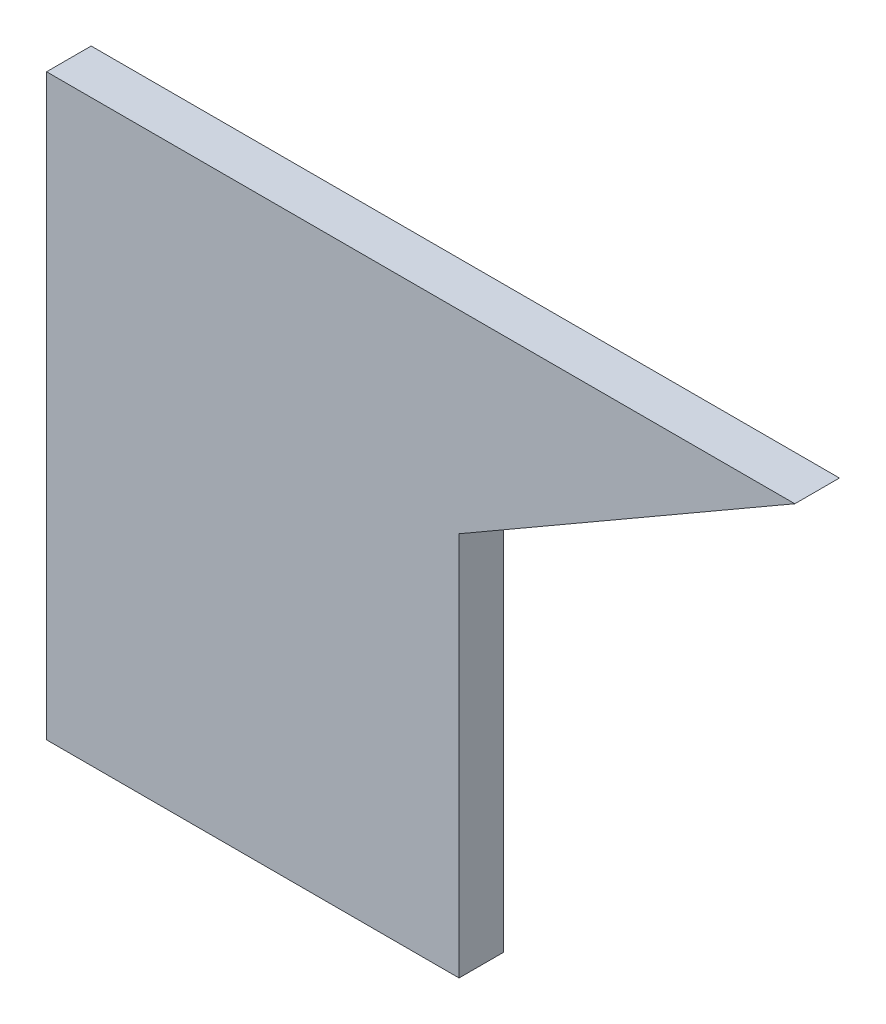
ISO-10303-21;
HEADER;
FILE_DESCRIPTION(('STEP AP214'),'2;1');
FILE_NAME('part.step','',(''),(''),'','','');
FILE_SCHEMA(('AUTOMOTIVE_DESIGN { 1 0 10303 214 1 1 1 1 }'));
ENDSEC;
DATA;
#1=APPLICATION_CONTEXT('core data for automotive mechanical design processes');
#2=APPLICATION_PROTOCOL_DEFINITION('international standard','automotive_design',2000,#1);
#3=PRODUCT_CONTEXT('',#1,'mechanical');
#4=PRODUCT('Part','Part','',(#3));
#5=PRODUCT_RELATED_PRODUCT_CATEGORY('part','',(#4));
#6=PRODUCT_DEFINITION_FORMATION('','',#4);
#7=PRODUCT_DEFINITION_CONTEXT('part definition',#1,'design');
#8=PRODUCT_DEFINITION('design','',#6,#7);
#9=PRODUCT_DEFINITION_SHAPE('','',#8);
#10=(LENGTH_UNIT() NAMED_UNIT(*) SI_UNIT(.MILLI.,.METRE.));
#11=(NAMED_UNIT(*) PLANE_ANGLE_UNIT() SI_UNIT($,.RADIAN.));
#12=(NAMED_UNIT(*) SI_UNIT($,.STERADIAN.) SOLID_ANGLE_UNIT());
#13=UNCERTAINTY_MEASURE_WITH_UNIT(LENGTH_MEASURE(1.E-05),#10,'distance_accuracy_value','');
#14=(GEOMETRIC_REPRESENTATION_CONTEXT(3) GLOBAL_UNCERTAINTY_ASSIGNED_CONTEXT((#13)) GLOBAL_UNIT_ASSIGNED_CONTEXT((#10,
#11,#12)) REPRESENTATION_CONTEXT('',''));
#15=CARTESIAN_POINT('',(0.,0.,0.));
#16=DIRECTION('',(0.,0.,1.));
#17=DIRECTION('',(1.,0.,0.));
#18=AXIS2_PLACEMENT_3D('',#15,#16,#17);
#19=CARTESIAN_POINT('',(-58.7375000000003,-82.3912500000004,6.35));
#20=DIRECTION('',(1.,0.,0.));
#21=DIRECTION('',(0.,0.,-1.));
#22=AXIS2_PLACEMENT_3D('',#19,#20,#21);
#23=PLANE('',#22);
#24=DIRECTION('',(0.,-1.,0.));
#25=VECTOR('',#24,1.);
#26=CARTESIAN_POINT('',(-58.7375000000003,-82.3912500000004,-6.35));
#27=LINE('',#26,#25);
#28=CARTESIAN_POINT('',(-58.7375000000003,82.3912499999996,-6.35));
#29=VERTEX_POINT('',#28);
#30=CARTESIAN_POINT('',(-58.7375000000003,-82.3912500000004,-6.35));
#31=VERTEX_POINT('',#30);
#32=EDGE_CURVE('E107',#29,#31,#27,.T.);
#33=ORIENTED_EDGE('',*,*,#32,.T.);
#34=DIRECTION('',(0.,0.,-1.));
#35=VECTOR('',#34,1.);
#36=CARTESIAN_POINT('',(-58.7375000000003,-82.3912500000004,6.35));
#37=LINE('',#36,#35);
#38=CARTESIAN_POINT('',(-58.7375000000003,-82.3912500000004,6.35));
#39=VERTEX_POINT('',#38);
#40=EDGE_CURVE('E11',#39,#31,#37,.T.);
#41=ORIENTED_EDGE('',*,*,#40,.F.);
#42=DIRECTION('',(0.,-1.,0.));
#43=VECTOR('',#42,1.);
#44=CARTESIAN_POINT('',(-58.7375000000003,-82.3912500000004,6.35));
#45=LINE('',#44,#43);
#46=CARTESIAN_POINT('',(-58.7375000000003,82.3912499999996,6.35));
#47=VERTEX_POINT('',#46);
#48=EDGE_CURVE('E115',#47,#39,#45,.T.);
#49=ORIENTED_EDGE('',*,*,#48,.F.);
#50=DIRECTION('',(0.,0.,-1.));
#51=VECTOR('',#50,1.);
#52=CARTESIAN_POINT('',(-58.7375000000003,82.3912499999996,6.35));
#53=LINE('',#52,#51);
#54=EDGE_CURVE('E103',#47,#29,#53,.T.);
#55=ORIENTED_EDGE('',*,*,#54,.T.);
#56=EDGE_LOOP('',(#33,#41,#49,#55));
#57=FACE_BOUND('',#56,.T.);
#58=ADVANCED_FACE('F33',(#57),#23,.F.);
#59=CARTESIAN_POINT('',(-58.7375000000003,-82.3912500000004,6.35));
#60=DIRECTION('',(0.,1.,0.));
#61=DIRECTION('',(-1.,0.,0.));
#62=AXIS2_PLACEMENT_3D('',#59,#60,#61);
#63=PLANE('',#62);
#64=DIRECTION('',(1.,0.,0.));
#65=VECTOR('',#64,1.);
#66=CARTESIAN_POINT('',(-58.7375000000003,-82.3912500000004,-6.35));
#67=LINE('',#66,#65);
#68=CARTESIAN_POINT('',(58.7374999999981,-82.3912499999991,-6.35));
#69=VERTEX_POINT('',#68);
#70=EDGE_CURVE('E110',#31,#69,#67,.T.);
#71=ORIENTED_EDGE('',*,*,#70,.T.);
#72=DIRECTION('',(0.,0.,-1.));
#73=VECTOR('',#72,1.);
#74=CARTESIAN_POINT('',(58.7374999999981,-82.3912499999991,6.35));
#75=LINE('',#74,#73);
#76=CARTESIAN_POINT('',(58.7374999999981,-82.3912499999991,6.35));
#77=VERTEX_POINT('',#76);
#78=EDGE_CURVE('E41',#77,#69,#75,.T.);
#79=ORIENTED_EDGE('',*,*,#78,.F.);
#80=DIRECTION('',(1.,0.,0.));
#81=VECTOR('',#80,1.);
#82=CARTESIAN_POINT('',(-58.7375000000003,-82.3912500000004,6.35));
#83=LINE('',#82,#81);
#84=EDGE_CURVE('E83',#39,#77,#83,.T.);
#85=ORIENTED_EDGE('',*,*,#84,.F.);
#86=ORIENTED_EDGE('',*,*,#40,.T.);
#87=EDGE_LOOP('',(#71,#79,#85,#86));
#88=FACE_BOUND('',#87,.T.);
#89=ADVANCED_FACE('F134',(#88),#63,.F.);
#90=CARTESIAN_POINT('',(58.7374999999981,-82.3912499999991,6.35));
#91=DIRECTION('',(-1.,0.,0.));
#92=DIRECTION('',(0.,-1.,0.));
#93=AXIS2_PLACEMENT_3D('',#90,#91,#92);
#94=PLANE('',#93);
#95=DIRECTION('',(0.,1.,0.));
#96=VECTOR('',#95,1.);
#97=CARTESIAN_POINT('',(58.7374999999981,-82.3912499999991,-6.35));
#98=LINE('',#97,#96);
#99=CARTESIAN_POINT('',(58.7375000000009,27.1775809065801,-6.35));
#100=VERTEX_POINT('',#99);
#101=EDGE_CURVE('E98',#69,#100,#98,.T.);
#102=ORIENTED_EDGE('',*,*,#101,.T.);
#103=DIRECTION('',(0.,0.,-1.));
#104=VECTOR('',#103,1.);
#105=CARTESIAN_POINT('',(58.7375000000009,27.1775809065801,6.35));
#106=LINE('',#105,#104);
#107=CARTESIAN_POINT('',(58.7375000000009,27.1775809065801,6.35));
#108=VERTEX_POINT('',#107);
#109=EDGE_CURVE('E95',#108,#100,#106,.T.);
#110=ORIENTED_EDGE('',*,*,#109,.F.);
#111=DIRECTION('',(0.,1.,0.));
#112=VECTOR('',#111,1.);
#113=CARTESIAN_POINT('',(58.7374999999981,-82.3912499999991,6.35));
#114=LINE('',#113,#112);
#115=EDGE_CURVE('E87',#77,#108,#114,.T.);
#116=ORIENTED_EDGE('',*,*,#115,.F.);
#117=ORIENTED_EDGE('',*,*,#78,.T.);
#118=EDGE_LOOP('',(#102,#110,#116,#117));
#119=FACE_BOUND('',#118,.T.);
#120=ADVANCED_FACE('F96',(#119),#94,.F.);
#121=CARTESIAN_POINT('',(58.7375000000009,27.1775809065801,6.35));
#122=DIRECTION('',(-0.500000000000001,0.866025403784438,0.));
#123=DIRECTION('',(-0.866025403784438,-0.500000000000001,0.));
#124=AXIS2_PLACEMENT_3D('',#121,#122,#123);
#125=PLANE('',#124);
#126=DIRECTION('',(0.866025403784438,0.500000000000001,0.));
#127=VECTOR('',#126,1.);
#128=CARTESIAN_POINT('',(58.7375000000009,27.1775809065801,-6.35));
#129=LINE('',#128,#127);
#130=CARTESIAN_POINT('',(154.370380142099,82.3912499999996,-6.35));
#131=VERTEX_POINT('',#130);
#132=EDGE_CURVE('E69',#100,#131,#129,.T.);
#133=ORIENTED_EDGE('',*,*,#132,.T.);
#134=DIRECTION('',(0.,0.,-1.));
#135=VECTOR('',#134,1.);
#136=CARTESIAN_POINT('',(154.370380142099,82.3912499999996,6.35));
#137=LINE('',#136,#135);
#138=CARTESIAN_POINT('',(154.370380142099,82.3912499999996,6.35));
#139=VERTEX_POINT('',#138);
#140=EDGE_CURVE('E99',#139,#131,#137,.T.);
#141=ORIENTED_EDGE('',*,*,#140,.F.);
#142=DIRECTION('',(0.866025403784438,0.500000000000001,0.));
#143=VECTOR('',#142,1.);
#144=CARTESIAN_POINT('',(58.7375000000009,27.1775809065801,6.35));
#145=LINE('',#144,#143);
#146=EDGE_CURVE('E91',#108,#139,#145,.T.);
#147=ORIENTED_EDGE('',*,*,#146,.F.);
#148=ORIENTED_EDGE('',*,*,#109,.T.);
#149=EDGE_LOOP('',(#133,#141,#147,#148));
#150=FACE_BOUND('',#149,.T.);
#151=ADVANCED_FACE('F101',(#150),#125,.F.);
#152=CARTESIAN_POINT('',(-58.7375000000003,82.3912499999996,6.35));
#153=DIRECTION('',(0.,-1.,0.));
#154=DIRECTION('',(1.,0.,0.));
#155=AXIS2_PLACEMENT_3D('',#152,#153,#154);
#156=PLANE('',#155);
#157=DIRECTION('',(-1.,0.,0.));
#158=VECTOR('',#157,1.);
#159=CARTESIAN_POINT('',(-58.7375000000003,82.3912499999996,-6.35));
#160=LINE('',#159,#158);
#161=EDGE_CURVE('E75',#131,#29,#160,.T.);
#162=ORIENTED_EDGE('',*,*,#161,.T.);
#163=ORIENTED_EDGE('',*,*,#54,.F.);
#164=DIRECTION('',(-1.,0.,0.));
#165=VECTOR('',#164,1.);
#166=CARTESIAN_POINT('',(-58.7375000000003,82.3912499999996,6.35));
#167=LINE('',#166,#165);
#168=EDGE_CURVE('E49',#139,#47,#167,.T.);
#169=ORIENTED_EDGE('',*,*,#168,.F.);
#170=ORIENTED_EDGE('',*,*,#140,.T.);
#171=EDGE_LOOP('',(#162,#163,#169,#170));
#172=FACE_BOUND('',#171,.T.);
#173=ADVANCED_FACE('F123',(#172),#156,.F.);
#174=CARTESIAN_POINT('',(0.,0.,6.35));
#175=DIRECTION('',(0.,0.,-1.));
#176=DIRECTION('',(-1.,0.,0.));
#177=AXIS2_PLACEMENT_3D('',#174,#175,#176);
#178=PLANE('',#177);
#179=ORIENTED_EDGE('',*,*,#48,.T.);
#180=ORIENTED_EDGE('',*,*,#84,.T.);
#181=ORIENTED_EDGE('',*,*,#115,.T.);
#182=ORIENTED_EDGE('',*,*,#146,.T.);
#183=ORIENTED_EDGE('',*,*,#168,.T.);
#184=EDGE_LOOP('',(#179,#180,#181,#182,#183));
#185=FACE_BOUND('',#184,.T.);
#186=ADVANCED_FACE('F89',(#185),#178,.F.);
#187=CARTESIAN_POINT('',(0.,0.,-6.35));
#188=DIRECTION('',(0.,0.,-1.));
#189=DIRECTION('',(-1.,0.,0.));
#190=AXIS2_PLACEMENT_3D('',#187,#188,#189);
#191=PLANE('',#190);
#192=ORIENTED_EDGE('',*,*,#32,.F.);
#193=ORIENTED_EDGE('',*,*,#161,.F.);
#194=ORIENTED_EDGE('',*,*,#132,.F.);
#195=ORIENTED_EDGE('',*,*,#101,.F.);
#196=ORIENTED_EDGE('',*,*,#70,.F.);
#197=EDGE_LOOP('',(#192,#193,#194,#195,#196));
#198=FACE_BOUND('',#197,.T.);
#199=ADVANCED_FACE('F119',(#198),#191,.T.);
#200=CLOSED_SHELL('',(#58,#89,#120,#151,#173,#186,#199));
#201=MANIFOLD_SOLID_BREP('B2',#200);
#202=ADVANCED_BREP_SHAPE_REPRESENTATION('',(#18,#201),#14);
#203=SHAPE_DEFINITION_REPRESENTATION(#9,#202);
ENDSEC;
END-ISO-10303-21;
